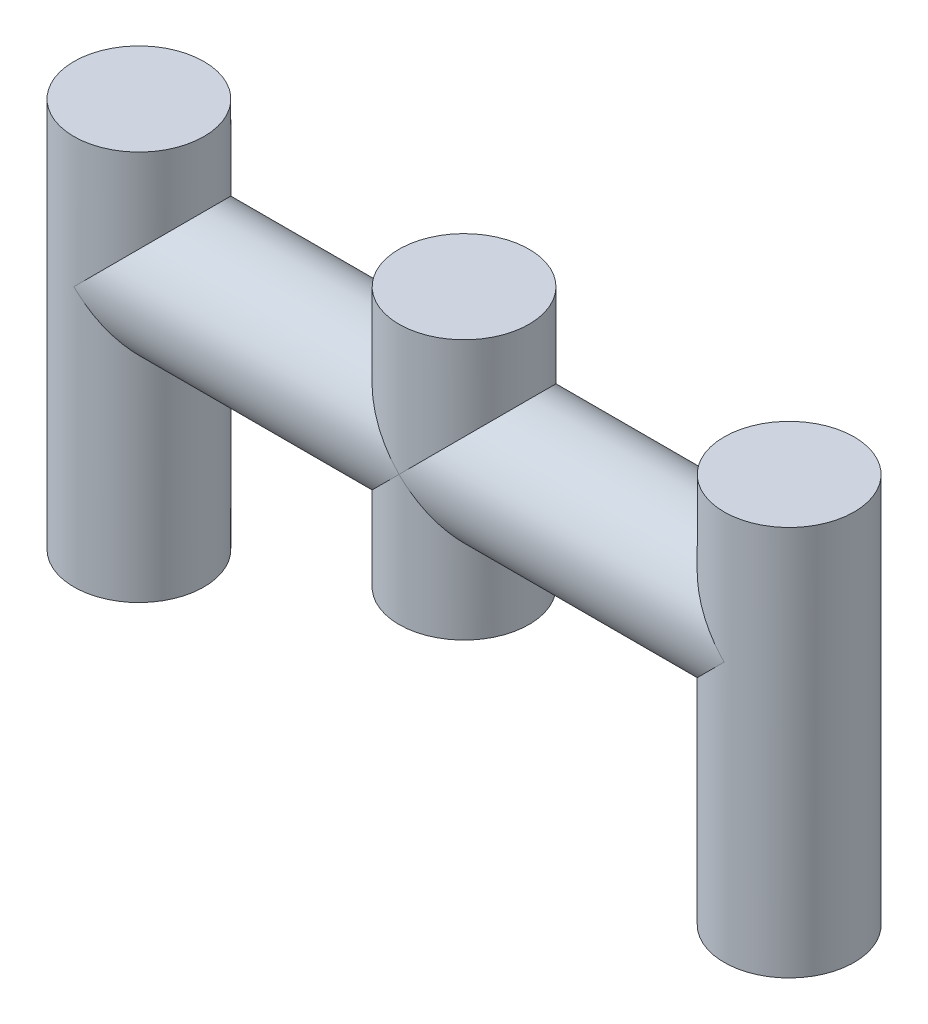
ISO-10303-21;
HEADER;
FILE_DESCRIPTION(('STEP AP214'),'2;1');
FILE_NAME('part.step','',(''),(''),'','','');
FILE_SCHEMA(('AUTOMOTIVE_DESIGN { 1 0 10303 214 1 1 1 1 }'));
ENDSEC;
DATA;
#1=APPLICATION_CONTEXT('core data for automotive mechanical design processes');
#2=APPLICATION_PROTOCOL_DEFINITION('international standard','automotive_design',2000,#1);
#3=PRODUCT_CONTEXT('',#1,'mechanical');
#4=PRODUCT('Part','Part','',(#3));
#5=PRODUCT_RELATED_PRODUCT_CATEGORY('part','',(#4));
#6=PRODUCT_DEFINITION_FORMATION('','',#4);
#7=PRODUCT_DEFINITION_CONTEXT('part definition',#1,'design');
#8=PRODUCT_DEFINITION('design','',#6,#7);
#9=PRODUCT_DEFINITION_SHAPE('','',#8);
#10=(LENGTH_UNIT() NAMED_UNIT(*) SI_UNIT(.MILLI.,.METRE.));
#11=(NAMED_UNIT(*) PLANE_ANGLE_UNIT() SI_UNIT($,.RADIAN.));
#12=(NAMED_UNIT(*) SI_UNIT($,.STERADIAN.) SOLID_ANGLE_UNIT());
#13=UNCERTAINTY_MEASURE_WITH_UNIT(LENGTH_MEASURE(1.E-05),#10,'distance_accuracy_value','');
#14=(GEOMETRIC_REPRESENTATION_CONTEXT(3) GLOBAL_UNCERTAINTY_ASSIGNED_CONTEXT((#13)) GLOBAL_UNIT_ASSIGNED_CONTEXT((#10,
#11,#12)) REPRESENTATION_CONTEXT('',''));
#15=CARTESIAN_POINT('',(0.,0.,0.));
#16=DIRECTION('',(0.,0.,1.));
#17=DIRECTION('',(1.,0.,0.));
#18=AXIS2_PLACEMENT_3D('',#15,#16,#17);
#19=CARTESIAN_POINT('',(12.5,5.,0.));
#20=DIRECTION('',(-1.,0.,0.));
#21=DIRECTION('',(0.,0.,1.));
#22=AXIS2_PLACEMENT_3D('',#19,#20,#21);
#23=CYLINDRICAL_SURFACE('',#22,2.5);
#24=CARTESIAN_POINT('',(0.,5.,0.));
#25=DIRECTION('',(0.707106781186547,-0.707106781186547,0.));
#26=DIRECTION('',(-0.707106781186547,-0.707106781186547,0.));
#27=AXIS2_PLACEMENT_3D('',#24,#25,#26);
#28=ELLIPSE('',#27,3.53553390593274,2.5);
#29=CARTESIAN_POINT('',(0.,5.,-2.5));
#30=VERTEX_POINT('',#29);
#31=CARTESIAN_POINT('',(0.,5.,2.5));
#32=VERTEX_POINT('',#31);
#33=EDGE_CURVE('E43',#30,#32,#28,.T.);
#34=ORIENTED_EDGE('',*,*,#33,.T.);
#35=CARTESIAN_POINT('',(0.,5.,0.));
#36=DIRECTION('',(-0.707106781186547,-0.707106781186547,0.));
#37=DIRECTION('',(0.707106781186547,-0.707106781186547,0.));
#38=AXIS2_PLACEMENT_3D('',#35,#36,#37);
#39=ELLIPSE('',#38,3.53553390593274,2.5);
#40=EDGE_CURVE('E11',#32,#30,#39,.F.);
#41=ORIENTED_EDGE('',*,*,#40,.T.);
#42=EDGE_LOOP('',(#34,#41));
#43=FACE_BOUND('',#42,.T.);
#44=CARTESIAN_POINT('',(12.5,5.,0.));
#45=DIRECTION('',(-0.707106781186547,-0.707106781186547,0.));
#46=DIRECTION('',(-0.707106781186547,0.707106781186547,0.));
#47=AXIS2_PLACEMENT_3D('',#44,#45,#46);
#48=ELLIPSE('',#47,3.53553390593274,2.5);
#49=CARTESIAN_POINT('',(12.5,5.,-2.5));
#50=VERTEX_POINT('',#49);
#51=CARTESIAN_POINT('',(12.5,5.,2.5));
#52=VERTEX_POINT('',#51);
#53=EDGE_CURVE('E88',#50,#52,#48,.F.);
#54=ORIENTED_EDGE('',*,*,#53,.F.);
#55=CARTESIAN_POINT('',(12.5,5.,0.));
#56=DIRECTION('',(-0.707106781186547,0.707106781186547,0.));
#57=DIRECTION('',(-0.707106781186547,-0.707106781186547,0.));
#58=AXIS2_PLACEMENT_3D('',#55,#56,#57);
#59=ELLIPSE('',#58,3.53553390593274,2.5);
#60=EDGE_CURVE('E83',#52,#50,#59,.F.);
#61=ORIENTED_EDGE('',*,*,#60,.F.);
#62=EDGE_LOOP('',(#54,#61));
#63=FACE_BOUND('',#62,.T.);
#64=ADVANCED_FACE('F35',(#43,#63),#23,.T.);
#65=CARTESIAN_POINT('',(0.,10.,0.));
#66=DIRECTION('',(0.,-1.,0.));
#67=DIRECTION('',(0.,0.,-1.));
#68=AXIS2_PLACEMENT_3D('',#65,#66,#67);
#69=CYLINDRICAL_SURFACE('',#68,2.5);
#70=CARTESIAN_POINT('',(0.,10.,0.));
#71=DIRECTION('',(0.,1.,0.));
#72=DIRECTION('',(0.,0.,1.));
#73=AXIS2_PLACEMENT_3D('',#70,#71,#72);
#74=CIRCLE('',#73,2.5);
#75=CARTESIAN_POINT('',(0.,10.,2.5));
#76=VERTEX_POINT('',#75);
#77=EDGE_CURVE('E91',#76,#76,#74,.T.);
#78=ORIENTED_EDGE('',*,*,#77,.F.);
#79=EDGE_LOOP('',(#78));
#80=FACE_BOUND('',#79,.T.);
#81=ORIENTED_EDGE('',*,*,#40,.F.);
#82=ORIENTED_EDGE('',*,*,#33,.F.);
#83=EDGE_LOOP('',(#81,#82));
#84=FACE_BOUND('',#83,.T.);
#85=CARTESIAN_POINT('',(0.,-5.,0.));
#86=DIRECTION('',(0.,-1.,0.));
#87=DIRECTION('',(0.,0.,-1.));
#88=AXIS2_PLACEMENT_3D('',#85,#86,#87);
#89=CIRCLE('',#88,2.5);
#90=CARTESIAN_POINT('',(0.,-5.,-2.5));
#91=VERTEX_POINT('',#90);
#92=EDGE_CURVE('E105',#91,#91,#89,.T.);
#93=ORIENTED_EDGE('',*,*,#92,.F.);
#94=EDGE_LOOP('',(#93));
#95=FACE_BOUND('',#94,.T.);
#96=ADVANCED_FACE('F37',(#80,#84,#95),#69,.T.);
#97=CARTESIAN_POINT('',(0.,10.,0.));
#98=DIRECTION('',(0.,1.,0.));
#99=DIRECTION('',(0.,0.,1.));
#100=AXIS2_PLACEMENT_3D('',#97,#98,#99);
#101=PLANE('',#100);
#102=ORIENTED_EDGE('',*,*,#77,.T.);
#103=EDGE_LOOP('',(#102));
#104=FACE_BOUND('',#103,.T.);
#105=ADVANCED_FACE('F136',(#104),#101,.T.);
#106=CARTESIAN_POINT('',(12.5,0.,0.));
#107=DIRECTION('',(0.,1.,0.));
#108=DIRECTION('',(0.,0.,1.));
#109=AXIS2_PLACEMENT_3D('',#106,#107,#108);
#110=PLANE('',#109);
#111=CARTESIAN_POINT('',(12.5,0.,0.));
#112=DIRECTION('',(0.,1.,0.));
#113=DIRECTION('',(0.,0.,1.));
#114=AXIS2_PLACEMENT_3D('',#111,#112,#113);
#115=CIRCLE('',#114,2.5);
#116=CARTESIAN_POINT('',(12.5,0.,2.5));
#117=VERTEX_POINT('',#116);
#118=EDGE_CURVE('E69',#117,#117,#115,.T.);
#119=ORIENTED_EDGE('',*,*,#118,.F.);
#120=EDGE_LOOP('',(#119));
#121=FACE_BOUND('',#120,.T.);
#122=ADVANCED_FACE('F133',(#121),#110,.F.);
#123=CARTESIAN_POINT('',(12.5,10.,0.));
#124=DIRECTION('',(0.,-1.,0.));
#125=DIRECTION('',(0.,0.,-1.));
#126=AXIS2_PLACEMENT_3D('',#123,#124,#125);
#127=CYLINDRICAL_SURFACE('',#126,2.5);
#128=ORIENTED_EDGE('',*,*,#118,.T.);
#129=EDGE_LOOP('',(#128));
#130=FACE_BOUND('',#129,.T.);
#131=CARTESIAN_POINT('',(12.5,5.,0.));
#132=DIRECTION('',(-0.707106781186547,-0.707106781186547,0.));
#133=DIRECTION('',(0.707106781186547,-0.707106781186547,0.));
#134=AXIS2_PLACEMENT_3D('',#131,#132,#133);
#135=ELLIPSE('',#134,3.53553390593274,2.5);
#136=EDGE_CURVE('E103',#52,#50,#135,.F.);
#137=ORIENTED_EDGE('',*,*,#136,.F.);
#138=ORIENTED_EDGE('',*,*,#60,.T.);
#139=EDGE_LOOP('',(#137,#138));
#140=FACE_BOUND('',#139,.T.);
#141=ADVANCED_FACE('F102',(#130,#140),#127,.T.);
#142=ORIENTED_EDGE('',*,*,#53,.T.);
#143=CARTESIAN_POINT('',(12.5,5.,0.));
#144=DIRECTION('',(-0.707106781186547,0.707106781186547,0.));
#145=DIRECTION('',(0.707106781186547,0.707106781186547,0.));
#146=AXIS2_PLACEMENT_3D('',#143,#144,#145);
#147=ELLIPSE('',#146,3.53553390593274,2.5);
#148=EDGE_CURVE('E76',#50,#52,#147,.F.);
#149=ORIENTED_EDGE('',*,*,#148,.F.);
#150=EDGE_LOOP('',(#142,#149));
#151=FACE_BOUND('',#150,.T.);
#152=CARTESIAN_POINT('',(12.5,10.,0.));
#153=DIRECTION('',(0.,1.,0.));
#154=DIRECTION('',(0.,0.,1.));
#155=AXIS2_PLACEMENT_3D('',#152,#153,#154);
#156=CIRCLE('',#155,2.5);
#157=CARTESIAN_POINT('',(12.5,10.,2.5));
#158=VERTEX_POINT('',#157);
#159=EDGE_CURVE('E80',#158,#158,#156,.T.);
#160=ORIENTED_EDGE('',*,*,#159,.F.);
#161=EDGE_LOOP('',(#160));
#162=FACE_BOUND('',#161,.T.);
#163=ADVANCED_FACE('F131',(#151,#162),#127,.T.);
#164=CARTESIAN_POINT('',(12.5,10.,0.));
#165=DIRECTION('',(0.,1.,0.));
#166=DIRECTION('',(0.,0.,1.));
#167=AXIS2_PLACEMENT_3D('',#164,#165,#166);
#168=PLANE('',#167);
#169=ORIENTED_EDGE('',*,*,#159,.T.);
#170=EDGE_LOOP('',(#169));
#171=FACE_BOUND('',#170,.T.);
#172=ADVANCED_FACE('F126',(#171),#168,.T.);
#173=CARTESIAN_POINT('',(12.5,5.,0.));
#174=DIRECTION('',(1.,0.,0.));
#175=DIRECTION('',(0.,0.,1.));
#176=AXIS2_PLACEMENT_3D('',#173,#174,#175);
#177=CYLINDRICAL_SURFACE('',#176,2.5);
#178=CARTESIAN_POINT('',(25.,5.,0.));
#179=DIRECTION('',(0.707106781186547,0.707106781186547,0.));
#180=DIRECTION('',(0.707106781186547,-0.707106781186547,0.));
#181=AXIS2_PLACEMENT_3D('',#178,#179,#180);
#182=ELLIPSE('',#181,3.53553390593274,2.5);
#183=CARTESIAN_POINT('',(25.,5.,-2.5));
#184=VERTEX_POINT('',#183);
#185=CARTESIAN_POINT('',(25.,5.,2.5));
#186=VERTEX_POINT('',#185);
#187=EDGE_CURVE('E67',#184,#186,#182,.T.);
#188=ORIENTED_EDGE('',*,*,#187,.F.);
#189=CARTESIAN_POINT('',(25.,5.,0.));
#190=DIRECTION('',(-0.707106781186547,0.707106781186547,0.));
#191=DIRECTION('',(-0.707106781186547,-0.707106781186547,0.));
#192=AXIS2_PLACEMENT_3D('',#189,#190,#191);
#193=ELLIPSE('',#192,3.53553390593274,2.5);
#194=EDGE_CURVE('E63',#186,#184,#193,.F.);
#195=ORIENTED_EDGE('',*,*,#194,.F.);
#196=EDGE_LOOP('',(#188,#195));
#197=FACE_BOUND('',#196,.T.);
#198=ORIENTED_EDGE('',*,*,#148,.T.);
#199=ORIENTED_EDGE('',*,*,#136,.T.);
#200=EDGE_LOOP('',(#198,#199));
#201=FACE_BOUND('',#200,.T.);
#202=ADVANCED_FACE('F65',(#197,#201),#177,.T.);
#203=CARTESIAN_POINT('',(25.,10.,0.));
#204=DIRECTION('',(0.,-1.,0.));
#205=DIRECTION('',(0.,0.,-1.));
#206=AXIS2_PLACEMENT_3D('',#203,#204,#205);
#207=CYLINDRICAL_SURFACE('',#206,2.5);
#208=CARTESIAN_POINT('',(25.,10.,0.));
#209=DIRECTION('',(0.,-1.,0.));
#210=DIRECTION('',(0.,0.,1.));
#211=AXIS2_PLACEMENT_3D('',#208,#209,#210);
#212=CIRCLE('',#211,2.5);
#213=CARTESIAN_POINT('',(25.,10.,2.5));
#214=VERTEX_POINT('',#213);
#215=EDGE_CURVE('E73',#214,#214,#212,.T.);
#216=ORIENTED_EDGE('',*,*,#215,.T.);
#217=EDGE_LOOP('',(#216));
#218=FACE_BOUND('',#217,.T.);
#219=ORIENTED_EDGE('',*,*,#194,.T.);
#220=ORIENTED_EDGE('',*,*,#187,.T.);
#221=EDGE_LOOP('',(#219,#220));
#222=FACE_BOUND('',#221,.T.);
#223=CARTESIAN_POINT('',(25.,-5.,0.));
#224=DIRECTION('',(0.,-1.,0.));
#225=DIRECTION('',(0.,0.,-1.));
#226=AXIS2_PLACEMENT_3D('',#223,#224,#225);
#227=CIRCLE('',#226,2.49999999999997);
#228=CARTESIAN_POINT('',(25.,-5.,-2.49999999999995));
#229=VERTEX_POINT('',#228);
#230=EDGE_CURVE('E110',#229,#229,#227,.T.);
#231=ORIENTED_EDGE('',*,*,#230,.F.);
#232=EDGE_LOOP('',(#231));
#233=FACE_BOUND('',#232,.T.);
#234=ADVANCED_FACE('F71',(#218,#222,#233),#207,.T.);
#235=CARTESIAN_POINT('',(25.,10.,0.));
#236=DIRECTION('',(0.,1.,0.));
#237=DIRECTION('',(0.,0.,1.));
#238=AXIS2_PLACEMENT_3D('',#235,#236,#237);
#239=PLANE('',#238);
#240=ORIENTED_EDGE('',*,*,#215,.F.);
#241=EDGE_LOOP('',(#240));
#242=FACE_BOUND('',#241,.T.);
#243=ADVANCED_FACE('F116',(#242),#239,.T.);
#244=CARTESIAN_POINT('',(0.,-5.,0.));
#245=DIRECTION('',(0.,-1.,0.));
#246=DIRECTION('',(0.,0.,-1.));
#247=AXIS2_PLACEMENT_3D('',#244,#245,#246);
#248=PLANE('',#247);
#249=ORIENTED_EDGE('',*,*,#92,.T.);
#250=EDGE_LOOP('',(#249));
#251=FACE_BOUND('',#250,.T.);
#252=ADVANCED_FACE('F123',(#251),#248,.T.);
#253=CARTESIAN_POINT('',(25.,-5.,0.));
#254=DIRECTION('',(0.,-1.,0.));
#255=DIRECTION('',(0.,0.,-1.));
#256=AXIS2_PLACEMENT_3D('',#253,#254,#255);
#257=PLANE('',#256);
#258=ORIENTED_EDGE('',*,*,#230,.T.);
#259=EDGE_LOOP('',(#258));
#260=FACE_BOUND('',#259,.T.);
#261=ADVANCED_FACE('F114',(#260),#257,.T.);
#262=CLOSED_SHELL('',(#64,#96,#105,#122,#141,#163,#172,#202,#234,#243,#252,#261));
#263=MANIFOLD_SOLID_BREP('B2',#262);
#264=ADVANCED_BREP_SHAPE_REPRESENTATION('',(#18,#263),#14);
#265=SHAPE_DEFINITION_REPRESENTATION(#9,#264);
ENDSEC;
END-ISO-10303-21;
